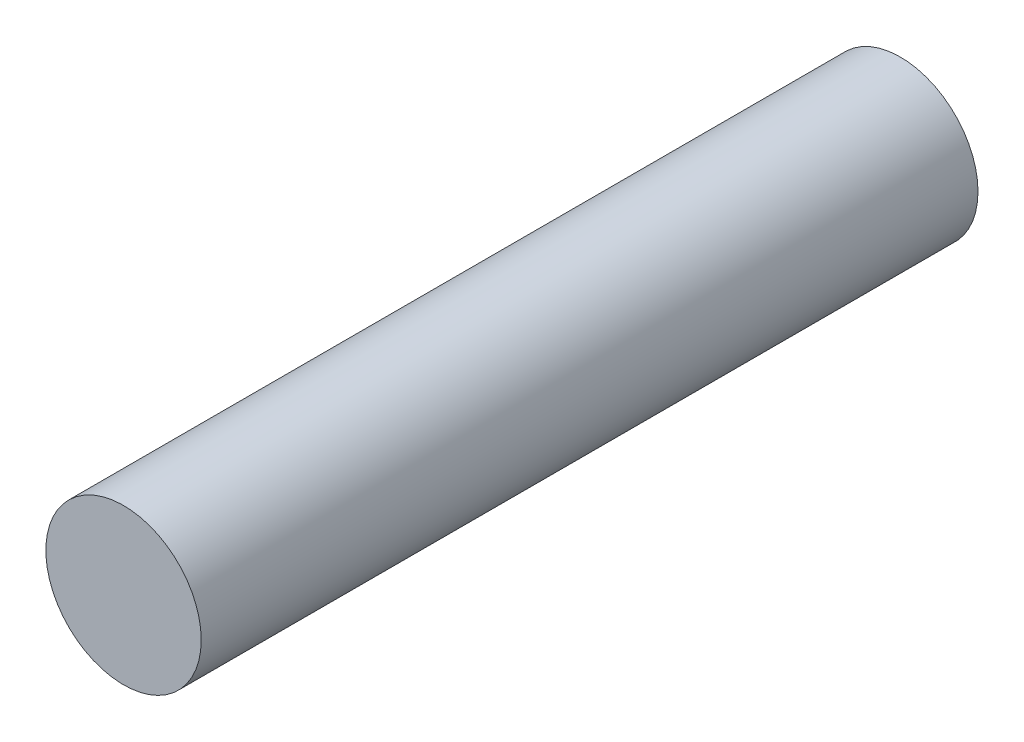
ISO-10303-21;
HEADER;
FILE_DESCRIPTION(('STEP AP214'),'2;1');
FILE_NAME('part.step','',(''),(''),'','','');
FILE_SCHEMA(('AUTOMOTIVE_DESIGN { 1 0 10303 214 1 1 1 1 }'));
ENDSEC;
DATA;
#1=APPLICATION_CONTEXT('core data for automotive mechanical design processes');
#2=APPLICATION_PROTOCOL_DEFINITION('international standard','automotive_design',2000,#1);
#3=PRODUCT_CONTEXT('',#1,'mechanical');
#4=PRODUCT('Part','Part','',(#3));
#5=PRODUCT_RELATED_PRODUCT_CATEGORY('part','',(#4));
#6=PRODUCT_DEFINITION_FORMATION('','',#4);
#7=PRODUCT_DEFINITION_CONTEXT('part definition',#1,'design');
#8=PRODUCT_DEFINITION('design','',#6,#7);
#9=PRODUCT_DEFINITION_SHAPE('','',#8);
#10=(LENGTH_UNIT() NAMED_UNIT(*) SI_UNIT(.MILLI.,.METRE.));
#11=(NAMED_UNIT(*) PLANE_ANGLE_UNIT() SI_UNIT($,.RADIAN.));
#12=(NAMED_UNIT(*) SI_UNIT($,.STERADIAN.) SOLID_ANGLE_UNIT());
#13=UNCERTAINTY_MEASURE_WITH_UNIT(LENGTH_MEASURE(1.E-05),#10,'distance_accuracy_value','');
#14=(GEOMETRIC_REPRESENTATION_CONTEXT(3) GLOBAL_UNCERTAINTY_ASSIGNED_CONTEXT((#13)) GLOBAL_UNIT_ASSIGNED_CONTEXT((#10,
#11,#12)) REPRESENTATION_CONTEXT('',''));
#15=CARTESIAN_POINT('',(0.,0.,0.));
#16=DIRECTION('',(0.,0.,1.));
#17=DIRECTION('',(1.,0.,0.));
#18=AXIS2_PLACEMENT_3D('',#15,#16,#17);
#19=CARTESIAN_POINT('',(0.,0.,10.));
#20=DIRECTION('',(0.,0.,-1.));
#21=DIRECTION('',(-1.,0.,0.));
#22=AXIS2_PLACEMENT_3D('',#19,#20,#21);
#23=CYLINDRICAL_SURFACE('',#22,1.);
#24=CARTESIAN_POINT('',(0.,0.,10.));
#25=DIRECTION('',(0.,0.,1.));
#26=DIRECTION('',(1.,0.,0.));
#27=AXIS2_PLACEMENT_3D('',#24,#25,#26);
#28=CIRCLE('',#27,1.);
#29=CARTESIAN_POINT('',(1.,0.,10.));
#30=VERTEX_POINT('',#29);
#31=EDGE_CURVE('E10',#30,#30,#28,.T.);
#32=ORIENTED_EDGE('',*,*,#31,.F.);
#33=EDGE_LOOP('',(#32));
#34=FACE_BOUND('',#33,.T.);
#35=CARTESIAN_POINT('',(0.,0.,0.));
#36=DIRECTION('',(0.,0.,1.));
#37=DIRECTION('',(1.,0.,0.));
#38=AXIS2_PLACEMENT_3D('',#35,#36,#37);
#39=CIRCLE('',#38,1.);
#40=CARTESIAN_POINT('',(1.,0.,0.));
#41=VERTEX_POINT('',#40);
#42=EDGE_CURVE('E40',#41,#41,#39,.T.);
#43=ORIENTED_EDGE('',*,*,#42,.T.);
#44=EDGE_LOOP('',(#43));
#45=FACE_BOUND('',#44,.T.);
#46=ADVANCED_FACE('F37',(#34,#45),#23,.T.);
#47=CARTESIAN_POINT('',(0.,0.,10.));
#48=DIRECTION('',(0.,0.,1.));
#49=DIRECTION('',(1.,0.,0.));
#50=AXIS2_PLACEMENT_3D('',#47,#48,#49);
#51=PLANE('',#50);
#52=ORIENTED_EDGE('',*,*,#31,.T.);
#53=EDGE_LOOP('',(#52));
#54=FACE_BOUND('',#53,.T.);
#55=ADVANCED_FACE('F52',(#54),#51,.T.);
#56=CARTESIAN_POINT('',(0.,0.,0.));
#57=DIRECTION('',(0.,0.,1.));
#58=DIRECTION('',(1.,0.,0.));
#59=AXIS2_PLACEMENT_3D('',#56,#57,#58);
#60=PLANE('',#59);
#61=ORIENTED_EDGE('',*,*,#42,.F.);
#62=EDGE_LOOP('',(#61));
#63=FACE_BOUND('',#62,.T.);
#64=ADVANCED_FACE('F50',(#63),#60,.F.);
#65=CLOSED_SHELL('',(#46,#55,#64));
#66=MANIFOLD_SOLID_BREP('B2',#65);
#67=ADVANCED_BREP_SHAPE_REPRESENTATION('',(#18,#66),#14);
#68=SHAPE_DEFINITION_REPRESENTATION(#9,#67);
ENDSEC;
END-ISO-10303-21;
